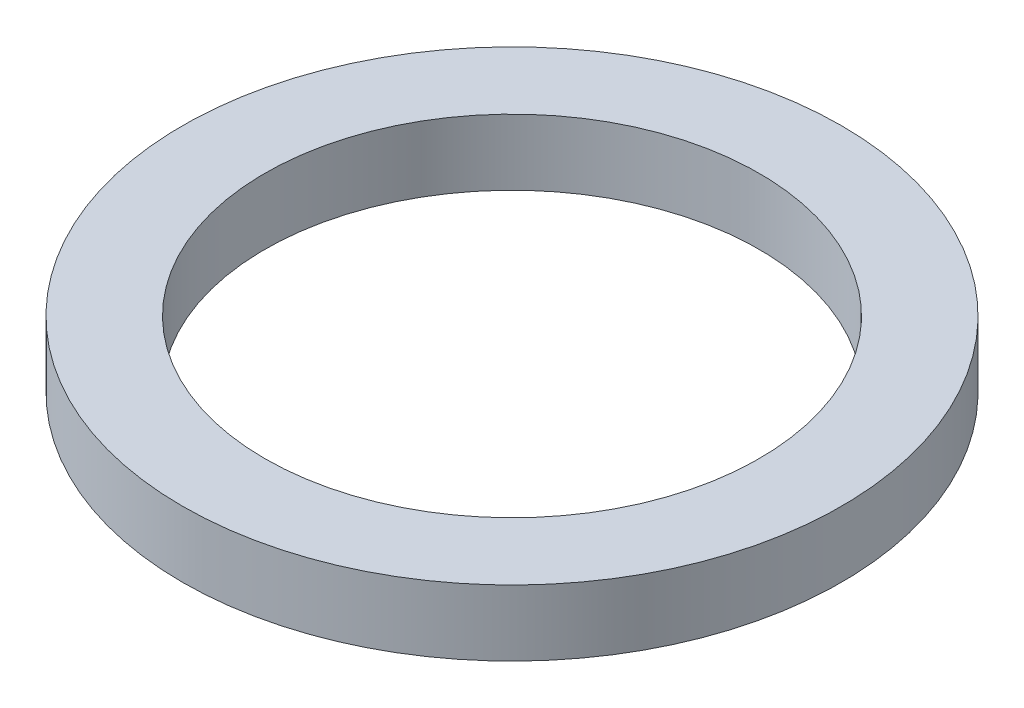
ISO-10303-21;
HEADER;
FILE_DESCRIPTION(('STEP AP214'),'2;1');
FILE_NAME('part.step','',(''),(''),'','','');
FILE_SCHEMA(('AUTOMOTIVE_DESIGN { 1 0 10303 214 1 1 1 1 }'));
ENDSEC;
DATA;
#1=APPLICATION_CONTEXT('core data for automotive mechanical design processes');
#2=APPLICATION_PROTOCOL_DEFINITION('international standard','automotive_design',2000,#1);
#3=PRODUCT_CONTEXT('',#1,'mechanical');
#4=PRODUCT('Part','Part','',(#3));
#5=PRODUCT_RELATED_PRODUCT_CATEGORY('part','',(#4));
#6=PRODUCT_DEFINITION_FORMATION('','',#4);
#7=PRODUCT_DEFINITION_CONTEXT('part definition',#1,'design');
#8=PRODUCT_DEFINITION('design','',#6,#7);
#9=PRODUCT_DEFINITION_SHAPE('','',#8);
#10=(LENGTH_UNIT() NAMED_UNIT(*) SI_UNIT(.MILLI.,.METRE.));
#11=(NAMED_UNIT(*) PLANE_ANGLE_UNIT() SI_UNIT($,.RADIAN.));
#12=(NAMED_UNIT(*) SI_UNIT($,.STERADIAN.) SOLID_ANGLE_UNIT());
#13=UNCERTAINTY_MEASURE_WITH_UNIT(LENGTH_MEASURE(1.E-05),#10,'distance_accuracy_value','');
#14=(GEOMETRIC_REPRESENTATION_CONTEXT(3) GLOBAL_UNCERTAINTY_ASSIGNED_CONTEXT((#13)) GLOBAL_UNIT_ASSIGNED_CONTEXT((#10,
#11,#12)) REPRESENTATION_CONTEXT('',''));
#15=CARTESIAN_POINT('',(0.,0.,0.));
#16=DIRECTION('',(0.,0.,1.));
#17=DIRECTION('',(1.,0.,0.));
#18=AXIS2_PLACEMENT_3D('',#15,#16,#17);
#19=CARTESIAN_POINT('',(0.,2.,0.));
#20=DIRECTION('',(0.,-1.,0.));
#21=DIRECTION('',(0.,0.,-1.));
#22=AXIS2_PLACEMENT_3D('',#19,#20,#21);
#23=CYLINDRICAL_SURFACE('',#22,10.);
#24=CARTESIAN_POINT('',(0.,2.,0.));
#25=DIRECTION('',(0.,1.,0.));
#26=DIRECTION('',(0.,0.,1.));
#27=AXIS2_PLACEMENT_3D('',#24,#25,#26);
#28=CIRCLE('',#27,10.);
#29=CARTESIAN_POINT('',(0.,2.,10.));
#30=VERTEX_POINT('',#29);
#31=EDGE_CURVE('E10',#30,#30,#28,.T.);
#32=ORIENTED_EDGE('',*,*,#31,.F.);
#33=EDGE_LOOP('',(#32));
#34=FACE_BOUND('',#33,.T.);
#35=CARTESIAN_POINT('',(0.,0.,0.));
#36=DIRECTION('',(0.,1.,0.));
#37=DIRECTION('',(0.,0.,1.));
#38=AXIS2_PLACEMENT_3D('',#35,#36,#37);
#39=CIRCLE('',#38,10.);
#40=CARTESIAN_POINT('',(0.,0.,10.));
#41=VERTEX_POINT('',#40);
#42=EDGE_CURVE('E40',#41,#41,#39,.T.);
#43=ORIENTED_EDGE('',*,*,#42,.T.);
#44=EDGE_LOOP('',(#43));
#45=FACE_BOUND('',#44,.T.);
#46=ADVANCED_FACE('F37',(#34,#45),#23,.T.);
#47=CARTESIAN_POINT('',(0.,2.,0.));
#48=DIRECTION('',(0.,1.,0.));
#49=DIRECTION('',(0.,0.,1.));
#50=AXIS2_PLACEMENT_3D('',#47,#48,#49);
#51=PLANE('',#50);
#52=CARTESIAN_POINT('',(0.,2.,0.));
#53=DIRECTION('',(0.,1.,0.));
#54=DIRECTION('',(0.,0.,1.));
#55=AXIS2_PLACEMENT_3D('',#52,#53,#54);
#56=CIRCLE('',#55,7.5);
#57=CARTESIAN_POINT('',(0.,2.,7.5));
#58=VERTEX_POINT('',#57);
#59=EDGE_CURVE('E51',#58,#58,#56,.T.);
#60=ORIENTED_EDGE('',*,*,#59,.F.);
#61=EDGE_LOOP('',(#60));
#62=FACE_BOUND('',#61,.T.);
#63=ORIENTED_EDGE('',*,*,#31,.T.);
#64=EDGE_LOOP('',(#63));
#65=FACE_BOUND('',#64,.T.);
#66=ADVANCED_FACE('F58',(#62,#65),#51,.T.);
#67=CARTESIAN_POINT('',(0.,0.,0.));
#68=DIRECTION('',(0.,1.,0.));
#69=DIRECTION('',(0.,0.,1.));
#70=AXIS2_PLACEMENT_3D('',#67,#68,#69);
#71=PLANE('',#70);
#72=CARTESIAN_POINT('',(0.,0.,0.));
#73=DIRECTION('',(0.,1.,0.));
#74=DIRECTION('',(0.,0.,1.));
#75=AXIS2_PLACEMENT_3D('',#72,#73,#74);
#76=CIRCLE('',#75,7.5);
#77=CARTESIAN_POINT('',(0.,0.,7.5));
#78=VERTEX_POINT('',#77);
#79=EDGE_CURVE('E47',#78,#78,#76,.F.);
#80=ORIENTED_EDGE('',*,*,#79,.F.);
#81=EDGE_LOOP('',(#80));
#82=FACE_BOUND('',#81,.T.);
#83=ORIENTED_EDGE('',*,*,#42,.F.);
#84=EDGE_LOOP('',(#83));
#85=FACE_BOUND('',#84,.T.);
#86=ADVANCED_FACE('F60',(#82,#85),#71,.F.);
#87=CARTESIAN_POINT('',(0.,-0.00100000000000013,0.));
#88=DIRECTION('',(0.,1.,0.));
#89=DIRECTION('',(0.,0.,1.));
#90=AXIS2_PLACEMENT_3D('',#87,#88,#89);
#91=CYLINDRICAL_SURFACE('',#90,7.5);
#92=ORIENTED_EDGE('',*,*,#59,.T.);
#93=EDGE_LOOP('',(#92));
#94=FACE_BOUND('',#93,.T.);
#95=ORIENTED_EDGE('',*,*,#79,.T.);
#96=EDGE_LOOP('',(#95));
#97=FACE_BOUND('',#96,.T.);
#98=ADVANCED_FACE('F55',(#94,#97),#91,.F.);
#99=CLOSED_SHELL('',(#46,#66,#86,#98));
#100=MANIFOLD_SOLID_BREP('B2',#99);
#101=ADVANCED_BREP_SHAPE_REPRESENTATION('',(#18,#100),#14);
#102=SHAPE_DEFINITION_REPRESENTATION(#9,#101);
ENDSEC;
END-ISO-10303-21;
